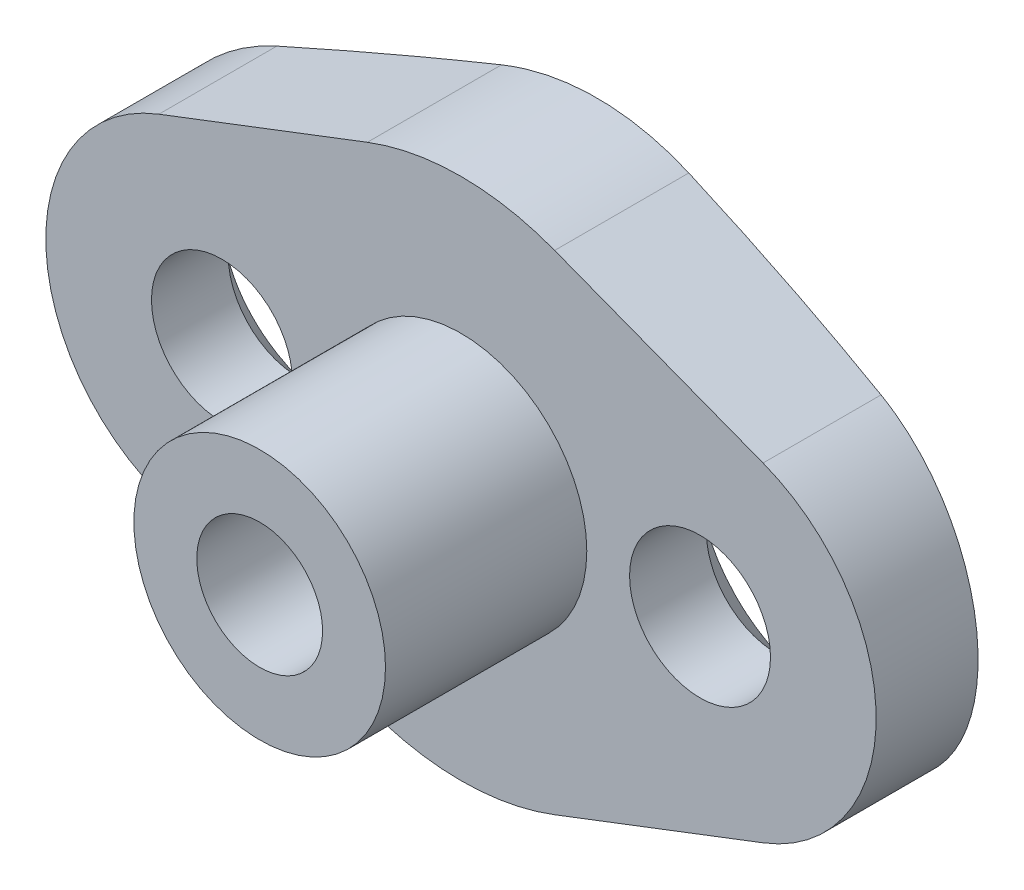
ISO-10303-21;
HEADER;
FILE_DESCRIPTION(('STEP AP214'),'2;1');
FILE_NAME('part.step','',(''),(''),'','','');
FILE_SCHEMA(('AUTOMOTIVE_DESIGN { 1 0 10303 214 1 1 1 1 }'));
ENDSEC;
DATA;
#1=APPLICATION_CONTEXT('core data for automotive mechanical design processes');
#2=APPLICATION_PROTOCOL_DEFINITION('international standard','automotive_design',2000,#1);
#3=PRODUCT_CONTEXT('',#1,'mechanical');
#4=PRODUCT('Part','Part','',(#3));
#5=PRODUCT_RELATED_PRODUCT_CATEGORY('part','',(#4));
#6=PRODUCT_DEFINITION_FORMATION('','',#4);
#7=PRODUCT_DEFINITION_CONTEXT('part definition',#1,'design');
#8=PRODUCT_DEFINITION('design','',#6,#7);
#9=PRODUCT_DEFINITION_SHAPE('','',#8);
#10=(LENGTH_UNIT() NAMED_UNIT(*) SI_UNIT(.MILLI.,.METRE.));
#11=(NAMED_UNIT(*) PLANE_ANGLE_UNIT() SI_UNIT($,.RADIAN.));
#12=(NAMED_UNIT(*) SI_UNIT($,.STERADIAN.) SOLID_ANGLE_UNIT());
#13=UNCERTAINTY_MEASURE_WITH_UNIT(LENGTH_MEASURE(1.E-05),#10,'distance_accuracy_value','');
#14=(GEOMETRIC_REPRESENTATION_CONTEXT(3) GLOBAL_UNCERTAINTY_ASSIGNED_CONTEXT((#13)) GLOBAL_UNIT_ASSIGNED_CONTEXT((#10,
#11,#12)) REPRESENTATION_CONTEXT('',''));
#15=CARTESIAN_POINT('',(0.,0.,0.));
#16=DIRECTION('',(0.,0.,1.));
#17=DIRECTION('',(1.,0.,0.));
#18=AXIS2_PLACEMENT_3D('',#15,#16,#17);
#19=CARTESIAN_POINT('',(0.,0.,3.429));
#20=DIRECTION('',(0.,0.,1.));
#21=DIRECTION('',(1.,0.,0.));
#22=AXIS2_PLACEMENT_3D('',#19,#20,#21);
#23=PLANE('',#22);
#24=CARTESIAN_POINT('',(-6.0325,0.,3.429));
#25=DIRECTION('',(0.,0.,1.));
#26=DIRECTION('',(1.,0.,0.));
#27=AXIS2_PLACEMENT_3D('',#24,#25,#26);
#28=CIRCLE('',#27,1.778);
#29=CARTESIAN_POINT('',(-4.2545,0.,3.429));
#30=VERTEX_POINT('',#29);
#31=EDGE_CURVE('E253',#30,#30,#28,.T.);
#32=ORIENTED_EDGE('',*,*,#31,.F.);
#33=EDGE_LOOP('',(#32));
#34=FACE_BOUND('',#33,.T.);
#35=CARTESIAN_POINT('',(0.,0.,3.429));
#36=DIRECTION('',(0.,0.,1.));
#37=DIRECTION('',(1.,0.,0.));
#38=AXIS2_PLACEMENT_3D('',#35,#36,#37);
#39=CIRCLE('',#38,6.604);
#40=CARTESIAN_POINT('',(2.36353684210526,6.16656384026072,3.429));
#41=VERTEX_POINT('',#40);
#42=CARTESIAN_POINT('',(-2.36353684210526,6.16656384026072,3.429));
#43=VERTEX_POINT('',#42);
#44=EDGE_CURVE('E254',#41,#43,#39,.T.);
#45=ORIENTED_EDGE('',*,*,#44,.T.);
#46=DIRECTION('',(-0.93376193825874,-0.357894736842106,0.));
#47=VECTOR('',#46,1.);
#48=CARTESIAN_POINT('',(-7.62334210526316,4.1505718155601,3.429));
#49=LINE('',#48,#47);
#50=CARTESIAN_POINT('',(-7.62334210526316,4.1505718155601,3.429));
#51=VERTEX_POINT('',#50);
#52=EDGE_CURVE('E257',#43,#51,#49,.T.);
#53=ORIENTED_EDGE('',*,*,#52,.T.);
#54=CARTESIAN_POINT('',(-6.0325,0.,3.429));
#55=DIRECTION('',(0.,0.,1.));
#56=DIRECTION('',(1.,0.,0.));
#57=AXIS2_PLACEMENT_3D('',#54,#55,#56);
#58=CIRCLE('',#57,4.445);
#59=CARTESIAN_POINT('',(-7.62334210526316,-4.1505718155601,3.429));
#60=VERTEX_POINT('',#59);
#61=EDGE_CURVE('E265',#51,#60,#58,.T.);
#62=ORIENTED_EDGE('',*,*,#61,.T.);
#63=DIRECTION('',(0.93376193825874,-0.357894736842106,0.));
#64=VECTOR('',#63,1.);
#65=CARTESIAN_POINT('',(-2.36353684210526,-6.16656384026072,3.429));
#66=LINE('',#65,#64);
#67=CARTESIAN_POINT('',(-2.36353684210527,-6.16656384026072,3.429));
#68=VERTEX_POINT('',#67);
#69=EDGE_CURVE('E267',#60,#68,#66,.T.);
#70=ORIENTED_EDGE('',*,*,#69,.T.);
#71=CARTESIAN_POINT('',(0.,0.,3.429));
#72=DIRECTION('',(0.,0.,1.));
#73=DIRECTION('',(1.,0.,0.));
#74=AXIS2_PLACEMENT_3D('',#71,#72,#73);
#75=CIRCLE('',#74,6.604);
#76=CARTESIAN_POINT('',(2.36353684210526,-6.16656384026072,3.429));
#77=VERTEX_POINT('',#76);
#78=EDGE_CURVE('E269',#68,#77,#75,.T.);
#79=ORIENTED_EDGE('',*,*,#78,.T.);
#80=DIRECTION('',(0.93376193825874,0.357894736842106,0.));
#81=VECTOR('',#80,1.);
#82=CARTESIAN_POINT('',(7.62334210526315,-4.1505718155601,3.429));
#83=LINE('',#82,#81);
#84=CARTESIAN_POINT('',(7.62334210526315,-4.1505718155601,3.429));
#85=VERTEX_POINT('',#84);
#86=EDGE_CURVE('E271',#77,#85,#83,.T.);
#87=ORIENTED_EDGE('',*,*,#86,.T.);
#88=CARTESIAN_POINT('',(6.0325,0.,3.429));
#89=DIRECTION('',(0.,0.,1.));
#90=DIRECTION('',(1.,0.,0.));
#91=AXIS2_PLACEMENT_3D('',#88,#89,#90);
#92=CIRCLE('',#91,4.445);
#93=CARTESIAN_POINT('',(7.62334210526315,4.1505718155601,3.429));
#94=VERTEX_POINT('',#93);
#95=EDGE_CURVE('E273',#85,#94,#92,.T.);
#96=ORIENTED_EDGE('',*,*,#95,.T.);
#97=DIRECTION('',(-0.93376193825874,0.357894736842106,0.));
#98=VECTOR('',#97,1.);
#99=CARTESIAN_POINT('',(2.36353684210526,6.16656384026072,3.429));
#100=LINE('',#99,#98);
#101=EDGE_CURVE('E62',#94,#41,#100,.T.);
#102=ORIENTED_EDGE('',*,*,#101,.T.);
#103=EDGE_LOOP('',(#45,#53,#62,#70,#79,#87,#96,#102));
#104=FACE_BOUND('',#103,.T.);
#105=CARTESIAN_POINT('',(6.0325,0.,3.429));
#106=DIRECTION('',(0.,0.,1.));
#107=DIRECTION('',(1.,0.,0.));
#108=AXIS2_PLACEMENT_3D('',#105,#106,#107);
#109=CIRCLE('',#108,1.778);
#110=CARTESIAN_POINT('',(7.8105,0.,3.429));
#111=VERTEX_POINT('',#110);
#112=EDGE_CURVE('E255',#111,#111,#109,.T.);
#113=ORIENTED_EDGE('',*,*,#112,.F.);
#114=EDGE_LOOP('',(#113));
#115=FACE_BOUND('',#114,.T.);
#116=CARTESIAN_POINT('',(0.,0.,3.429));
#117=DIRECTION('',(0.,0.,1.));
#118=DIRECTION('',(1.,0.,0.));
#119=AXIS2_PLACEMENT_3D('',#116,#117,#118);
#120=CIRCLE('',#119,3.175);
#121=CARTESIAN_POINT('',(3.175,0.,3.429));
#122=VERTEX_POINT('',#121);
#123=EDGE_CURVE('E343',#122,#122,#120,.T.);
#124=ORIENTED_EDGE('',*,*,#123,.F.);
#125=EDGE_LOOP('',(#124));
#126=FACE_BOUND('',#125,.T.);
#127=ADVANCED_FACE('F32',(#34,#104,#115,#126),#23,.T.);
#128=CARTESIAN_POINT('',(0.,0.,3.429));
#129=DIRECTION('',(0.,0.,-1.));
#130=DIRECTION('',(-1.,0.,0.));
#131=AXIS2_PLACEMENT_3D('',#128,#129,#130);
#132=CYLINDRICAL_SURFACE('',#131,6.604);
#133=DIRECTION('',(0.,0.,-1.));
#134=VECTOR('',#133,1.);
#135=CARTESIAN_POINT('',(2.36353684210526,6.16656384026072,3.429));
#136=LINE('',#135,#134);
#137=CARTESIAN_POINT('',(2.36353684210526,6.16656384026072,0.0433476332092745));
#138=VERTEX_POINT('',#137);
#139=EDGE_CURVE('E124',#41,#138,#136,.T.);
#140=ORIENTED_EDGE('',*,*,#139,.T.);
#141=CARTESIAN_POINT('',(2.36353684210526,6.16656384026072,0.0433476332092897));
#142=CARTESIAN_POINT('',(2.19113225550176,6.23266486368332,0.0370146986801548));
#143=CARTESIAN_POINT('',(2.01592422298994,6.29150563393318,0.031285571550085));
#144=CARTESIAN_POINT('',(1.66115963827824,6.39432576472167,0.0211661823809761));
#145=CARTESIAN_POINT('',(1.48160302088139,6.43830490229646,0.0167759404288562));
#146=CARTESIAN_POINT('',(1.1191562195515,6.51110880986811,0.00946075099816746));
#147=CARTESIAN_POINT('',(0.936261796829589,6.53991268845568,0.00653782379559852));
#148=CARTESIAN_POINT('',(0.568694591179152,6.58206773642733,0.00224688182175784));
#149=CARTESIAN_POINT('',(0.384021924124431,6.59541990589513,0.000878766418229665));
#150=CARTESIAN_POINT('',(0.0140636998647719,6.60657963426839,-0.000264129650065589));
#151=CARTESIAN_POINT('',(-0.171222214066304,6.60437548372269,-3.77100872107163E-05));
#152=CARTESIAN_POINT('',(-0.540945430951653,6.58441070930692,0.0020048369891241));
#153=CARTESIAN_POINT('',(-0.725382742391608,6.56665024133508,0.00382094857144389));
#154=CARTESIAN_POINT('',(-1.09165012542945,6.51576756721108,0.00898499810432978));
#155=CARTESIAN_POINT('',(-1.2734853359978,6.48268183051702,0.0123292991773756));
#156=CARTESIAN_POINT('',(-1.63363496052359,6.40141362126567,0.0204534834802808));
#157=CARTESIAN_POINT('',(-1.81195141073268,6.35324016932896,0.0252325088487417));
#158=CARTESIAN_POINT('',(-2.05115659197112,6.27773712085769,0.0326126985936294));
#159=CARTESIAN_POINT('',(-2.11413616686042,6.25680831823762,0.0346493351411315));
#160=CARTESIAN_POINT('',(-2.23937322268045,6.21308422357811,0.0388811498198487));
#161=CARTESIAN_POINT('',(-2.3016313178466,6.19029067653188,0.0410761795078104));
#162=CARTESIAN_POINT('',(-2.36353684210526,6.16656384026072,0.0433476332092683));
#163=B_SPLINE_CURVE_WITH_KNOTS('',3,(#141,#142,#143,#144,#145,#146,#147,#148,#149,#150,#151,
#152,#153,#154,#155,#156,#157,#158,#159,#160,#161,#162),.UNSPECIFIED.,.F.,.F.,(4,2,2,2,2,2,2,2,
2,2,4),(0.,0.554085963952449,1.10818024029252,1.6630353445262,2.21785453476585,2.77309138938259,
3.3283226797354,3.88223942425771,4.43582562403964,4.63499441789822,4.83397891964673),.UNSPECIFIED.);
#164=CARTESIAN_POINT('',(-2.36353684210526,6.16656384026072,0.0433476332092884));
#165=VERTEX_POINT('',#164);
#166=EDGE_CURVE('E54',#138,#165,#163,.T.);
#167=ORIENTED_EDGE('',*,*,#166,.T.);
#168=DIRECTION('',(0.,0.,-1.));
#169=VECTOR('',#168,1.);
#170=CARTESIAN_POINT('',(-2.36353684210526,6.16656384026072,3.429));
#171=LINE('',#170,#169);
#172=EDGE_CURVE('E46',#43,#165,#171,.T.);
#173=ORIENTED_EDGE('',*,*,#172,.F.);
#174=ORIENTED_EDGE('',*,*,#44,.F.);
#175=EDGE_LOOP('',(#140,#167,#173,#174));
#176=FACE_BOUND('',#175,.T.);
#177=ADVANCED_FACE('F34',(#176),#132,.T.);
#178=CARTESIAN_POINT('',(-7.62334210526316,4.1505718155601,3.429));
#179=DIRECTION('',(0.357894736842106,-0.933761938258741,0.));
#180=DIRECTION('',(0.93376193825874,0.357894736842106,0.));
#181=AXIS2_PLACEMENT_3D('',#178,#179,#180);
#182=PLANE('',#181);
#183=ORIENTED_EDGE('',*,*,#172,.T.);
#184=CARTESIAN_POINT('',(0.,7.0724664707527,64.4577916666666));
#185=DIRECTION('',(0.357894736842106,-0.933761938258741,0.));
#186=DIRECTION('',(0.93376193825874,0.357894736842106,0.));
#187=AXIS2_PLACEMENT_3D('',#184,#185,#186);
#188=ELLIPSE('',#187,69.0302196155758,64.4577916666666);
#189=CARTESIAN_POINT('',(-7.62334210526316,4.1505718155601,0.452389068998985));
#190=VERTEX_POINT('',#189);
#191=EDGE_CURVE('E151',#165,#190,#188,.F.);
#192=ORIENTED_EDGE('',*,*,#191,.T.);
#193=DIRECTION('',(0.,0.,-1.));
#194=VECTOR('',#193,1.);
#195=CARTESIAN_POINT('',(-7.62334210526316,4.1505718155601,3.429));
#196=LINE('',#195,#194);
#197=EDGE_CURVE('E139',#51,#190,#196,.T.);
#198=ORIENTED_EDGE('',*,*,#197,.F.);
#199=ORIENTED_EDGE('',*,*,#52,.F.);
#200=EDGE_LOOP('',(#183,#192,#198,#199));
#201=FACE_BOUND('',#200,.T.);
#202=ADVANCED_FACE('F200',(#201),#182,.F.);
#203=CARTESIAN_POINT('',(-6.0325,0.,3.429));
#204=DIRECTION('',(0.,0.,-1.));
#205=DIRECTION('',(-1.,0.,0.));
#206=AXIS2_PLACEMENT_3D('',#203,#204,#205);
#207=CYLINDRICAL_SURFACE('',#206,4.445);
#208=ORIENTED_EDGE('',*,*,#197,.T.);
#209=CARTESIAN_POINT('',(-7.62334210526316,4.1505718155601,0.452389068998985));
#210=CARTESIAN_POINT('',(-7.74057622327631,4.10565136906925,0.466349660186599));
#211=CARTESIAN_POINT('',(-7.85588548722114,4.05574633073941,0.480412686803095));
#212=CARTESIAN_POINT('',(-8.08186669999469,3.94637154507439,0.508567934648293));
#213=CARTESIAN_POINT('',(-8.19253880281101,3.88690211566458,0.522660154891219));
#214=CARTESIAN_POINT('',(-8.40842721948938,3.75882298015404,0.55069403140688));
#215=CARTESIAN_POINT('',(-8.51364547793329,3.69021656344799,0.564635739921534));
#216=CARTESIAN_POINT('',(-8.71792803546586,3.54432683131475,0.592188596513432));
#217=CARTESIAN_POINT('',(-8.81699241959098,3.46704363582785,0.605799749156832));
#218=CARTESIAN_POINT('',(-9.00830104315945,3.30430181581972,0.63250863227011));
#219=CARTESIAN_POINT('',(-9.10054273103318,3.21884015983062,0.645606169805134));
#220=CARTESIAN_POINT('',(-9.27753647828034,3.04032359412951,0.671098521303482));
#221=CARTESIAN_POINT('',(-9.36228575625208,2.94726588899328,0.683493073691196));
#222=CARTESIAN_POINT('',(-9.52358778094631,2.75429391479865,0.70738125424931));
#223=CARTESIAN_POINT('',(-9.60014580368112,2.65438412808179,0.718875461041067));
#224=CARTESIAN_POINT('',(-9.7445905992547,2.44831495237477,0.740798634319743));
#225=CARTESIAN_POINT('',(-9.81247418795911,2.34215328927112,0.751227209364205));
#226=CARTESIAN_POINT('',(-9.93869170919159,2.12494355870498,0.770796349661299));
#227=CARTESIAN_POINT('',(-9.99707449096839,2.01392446861039,0.779943467484897));
#228=CARTESIAN_POINT('',(-10.104304820242,1.78722109138748,0.796870530017214));
#229=CARTESIAN_POINT('',(-10.1531488279247,1.67153509152392,0.804649967076759));
#230=CARTESIAN_POINT('',(-10.240888341476,1.43639666961858,0.818707075194317));
#231=CARTESIAN_POINT('',(-10.279786525932,1.3169452714211,0.824985150566264));
#232=CARTESIAN_POINT('',(-10.3473618356965,1.07506548007919,0.835938634896015));
#233=CARTESIAN_POINT('',(-10.3760352297995,0.952636017560355,0.84061345877546));
#234=CARTESIAN_POINT('',(-10.4226303276747,0.707239958859992,0.848230793204893));
#235=CARTESIAN_POINT('',(-10.4406785545829,0.584298005157202,0.851193681043889));
#236=CARTESIAN_POINT('',(-10.466426749217,0.337262518172641,0.855425447746854));
#237=CARTESIAN_POINT('',(-10.4741231365493,0.213168601395575,0.856693740499732));
#238=CARTESIAN_POINT('',(-10.4790953039813,-0.035199630837515,0.857512779152884));
#239=CARTESIAN_POINT('',(-10.4763739116115,-0.159473888194154,0.857063991092791));
#240=CARTESIAN_POINT('',(-10.4605380347158,-0.407340381751441,0.854457519002144));
#241=CARTESIAN_POINT('',(-10.4474235605299,-0.5309326186305,0.852299836671751));
#242=CARTESIAN_POINT('',(-10.411022817235,-0.775743108068826,0.846331635253227));
#243=CARTESIAN_POINT('',(-10.3878035174828,-0.896971591803449,0.8425319992968));
#244=CARTESIAN_POINT('',(-10.3313943266048,-1.13698014734772,0.833346576149416));
#245=CARTESIAN_POINT('',(-10.298207886749,-1.25576105147892,0.827961338009345));
#246=CARTESIAN_POINT('',(-10.2221003651848,-1.4901199303104,0.815690385971445));
#247=CARTESIAN_POINT('',(-10.1791764612407,-1.60569696550461,0.808804237083265));
#248=CARTESIAN_POINT('',(-10.0839357099867,-1.83277025547032,0.793645793699511));
#249=CARTESIAN_POINT('',(-10.0316221925916,-1.94426794011413,0.785373990678841));
#250=CARTESIAN_POINT('',(-9.91769896320447,-2.16299151947157,0.767529519808536));
#251=CARTESIAN_POINT('',(-9.85604536916354,-2.27019405743133,0.757950733720048));
#252=CARTESIAN_POINT('',(-9.72410251093485,-2.47897980146094,0.737675625949307));
#253=CARTESIAN_POINT('',(-9.65381631239429,-2.58056498391096,0.726979701190813));
#254=CARTESIAN_POINT('',(-9.50502832630437,-2.77755672559336,0.704619154544034));
#255=CARTESIAN_POINT('',(-9.42651935727837,-2.87295776410808,0.692953687758825));
#256=CARTESIAN_POINT('',(-9.2619207242432,-3.05680964180566,0.668837724298323));
#257=CARTESIAN_POINT('',(-9.17583373855343,-3.14526291580686,0.656387505418397));
#258=CARTESIAN_POINT('',(-8.99550901236845,-3.31574944220701,0.630711820287464));
#259=CARTESIAN_POINT('',(-8.90118120285356,-3.39768625402679,0.617478482705008));
#260=CARTESIAN_POINT('',(-8.70603991854716,-3.5532766320954,0.590574177766143));
#261=CARTESIAN_POINT('',(-8.60522883559721,-3.62693322587626,0.576903372727004));
#262=CARTESIAN_POINT('',(-8.39796604231442,-3.76538247204404,0.549325981833211));
#263=CARTESIAN_POINT('',(-8.29152356411443,-3.83018904444413,0.535419805837608));
#264=CARTESIAN_POINT('',(-8.0736282003729,-3.95060749677176,0.507533798084385));
#265=CARTESIAN_POINT('',(-7.96217836060792,-4.00622487233643,0.493554015547771));
#266=CARTESIAN_POINT('',(-7.81149416165651,-4.07367917823502,0.475068459389649));
#267=CARTESIAN_POINT('',(-7.77413805550447,-4.08978946331433,0.470518575569447));
#268=CARTESIAN_POINT('',(-7.69903650036892,-4.12096240245139,0.461438870143913));
#269=CARTESIAN_POINT('',(-7.66129151305909,-4.13602616400982,0.456909032230524));
#270=CARTESIAN_POINT('',(-7.62334210526315,-4.1505718155601,0.452389068998987));
#271=B_SPLINE_CURVE_WITH_KNOTS('',3,(#209,#210,#211,#212,#213,#214,#215,#216,#217,#218,#219,
#220,#221,#222,#223,#224,#225,#226,#227,#228,#229,#230,#231,#232,#233,#234,#235,#236,#237,#238,
#239,#240,#241,#242,#243,#244,#245,#246,#247,#248,#249,#250,#251,#252,#253,#254,#255,#256,#257,
#258,#259,#260,#261,#262,#263,#264,#265,#266,#267,#268,#269,#270),.UNSPECIFIED.,.F.,.F.,(4,2,2,
2,2,2,2,2,2,2,2,2,2,2,2,2,2,2,2,2,2,2,2,2,2,2,2,2,2,2,4),(0.,0.378842897800705,
0.757673205266127,1.13636749735104,1.51505655533826,1.89388652778081,2.27285654757962,
2.65158098324695,3.03044404080111,3.40729299123099,3.78428152467548,4.16116842119043,
4.53819270994332,4.91063154373253,5.28319915995191,5.65566566330876,6.02813179610304,
6.39816614555902,6.76807251257981,7.13808622786357,7.50796898052653,7.87964676088774,
8.25119292903901,8.62306634194451,8.99480884629152,9.37129989745794,9.7476528397335,
10.1234068331714,10.4989352855171,10.6217311248764,10.7443949690389),.UNSPECIFIED.);
#272=CARTESIAN_POINT('',(-7.62334210526316,-4.1505718155601,0.452389068998983));
#273=VERTEX_POINT('',#272);
#274=EDGE_CURVE('E156',#190,#273,#271,.T.);
#275=ORIENTED_EDGE('',*,*,#274,.T.);
#276=DIRECTION('',(0.,0.,-1.));
#277=VECTOR('',#276,1.);
#278=CARTESIAN_POINT('',(-7.62334210526316,-4.1505718155601,3.429));
#279=LINE('',#278,#277);
#280=EDGE_CURVE('E136',#60,#273,#279,.T.);
#281=ORIENTED_EDGE('',*,*,#280,.F.);
#282=ORIENTED_EDGE('',*,*,#61,.F.);
#283=EDGE_LOOP('',(#208,#275,#281,#282));
#284=FACE_BOUND('',#283,.T.);
#285=ADVANCED_FACE('F195',(#284),#207,.T.);
#286=CARTESIAN_POINT('',(-2.36353684210526,-6.16656384026072,3.429));
#287=DIRECTION('',(0.357894736842106,0.933761938258741,0.));
#288=DIRECTION('',(-0.933761938258741,0.357894736842106,0.));
#289=AXIS2_PLACEMENT_3D('',#286,#287,#288);
#290=PLANE('',#289);
#291=ORIENTED_EDGE('',*,*,#280,.T.);
#292=CARTESIAN_POINT('',(0.,-7.07246647075271,64.4577916666666));
#293=DIRECTION('',(0.357894736842106,0.933761938258741,0.));
#294=DIRECTION('',(-0.933761938258741,0.357894736842106,0.));
#295=AXIS2_PLACEMENT_3D('',#292,#293,#294);
#296=ELLIPSE('',#295,69.0302196155758,64.4577916666666);
#297=CARTESIAN_POINT('',(-2.36353684210527,-6.16656384026072,0.0433476332092897));
#298=VERTEX_POINT('',#297);
#299=EDGE_CURVE('E194',#273,#298,#296,.F.);
#300=ORIENTED_EDGE('',*,*,#299,.T.);
#301=DIRECTION('',(0.,0.,-1.));
#302=VECTOR('',#301,1.);
#303=CARTESIAN_POINT('',(-2.36353684210527,-6.16656384026072,3.429));
#304=LINE('',#303,#302);
#305=EDGE_CURVE('E133',#68,#298,#304,.T.);
#306=ORIENTED_EDGE('',*,*,#305,.F.);
#307=ORIENTED_EDGE('',*,*,#69,.F.);
#308=EDGE_LOOP('',(#291,#300,#306,#307));
#309=FACE_BOUND('',#308,.T.);
#310=ADVANCED_FACE('F199',(#309),#290,.F.);
#311=CARTESIAN_POINT('',(0.,0.,3.429));
#312=DIRECTION('',(0.,0.,-1.));
#313=DIRECTION('',(-1.,0.,0.));
#314=AXIS2_PLACEMENT_3D('',#311,#312,#313);
#315=CYLINDRICAL_SURFACE('',#314,6.604);
#316=ORIENTED_EDGE('',*,*,#305,.T.);
#317=CARTESIAN_POINT('',(-2.36353684210527,-6.16656384026072,0.0433476332092897));
#318=CARTESIAN_POINT('',(-2.19113225550176,-6.23266486368332,0.037014698680153));
#319=CARTESIAN_POINT('',(-2.01592422298994,-6.29150563393318,0.0312855715500822));
#320=CARTESIAN_POINT('',(-1.66115963827824,-6.39432576472167,0.0211661823809725));
#321=CARTESIAN_POINT('',(-1.48160302088139,-6.43830490229646,0.0167759404288528));
#322=CARTESIAN_POINT('',(-1.1191562195515,-6.51110880986811,0.00946075099816516));
#323=CARTESIAN_POINT('',(-0.93626179682959,-6.53991268845568,0.00653782379559708));
#324=CARTESIAN_POINT('',(-0.568694591179153,-6.58206773642734,0.00224688182175703));
#325=CARTESIAN_POINT('',(-0.384021924124432,-6.59541990589513,0.000878766418228602));
#326=CARTESIAN_POINT('',(-0.0140636998647727,-6.60657963426839,-0.000264129650064957));
#327=CARTESIAN_POINT('',(0.171222214066304,-6.60437548372269,-3.77100872081415E-05));
#328=CARTESIAN_POINT('',(0.540945430951652,-6.58441070930692,0.00200483698912886));
#329=CARTESIAN_POINT('',(0.725382742391607,-6.56665024133508,0.00382094857144891));
#330=CARTESIAN_POINT('',(1.09165012542945,-6.51576756721108,0.00898499810432971));
#331=CARTESIAN_POINT('',(1.2734853359978,-6.48268183051702,0.0123292991773702));
#332=CARTESIAN_POINT('',(1.63363496052359,-6.40141362126567,0.0204534834802792));
#333=CARTESIAN_POINT('',(1.81195141073268,-6.35324016932896,0.0252325088487492));
#334=CARTESIAN_POINT('',(2.05115659197112,-6.27773712085769,0.0326126985936265));
#335=CARTESIAN_POINT('',(2.11413616686042,-6.25680831823762,0.0346493351411237));
#336=CARTESIAN_POINT('',(2.23937322268046,-6.21308422357811,0.0388811498198409));
#337=CARTESIAN_POINT('',(2.3016313178466,-6.19029067653188,0.0410761795078075));
#338=CARTESIAN_POINT('',(2.36353684210527,-6.16656384026072,0.0433476332092823));
#339=B_SPLINE_CURVE_WITH_KNOTS('',3,(#317,#318,#319,#320,#321,#322,#323,#324,#325,#326,#327,
#328,#329,#330,#331,#332,#333,#334,#335,#336,#337,#338),.UNSPECIFIED.,.F.,.F.,(4,2,2,2,2,2,2,2,
2,2,4),(0.,0.554085963952449,1.10818024029252,1.6630353445262,2.21785453476585,2.77309138938259,
3.3283226797354,3.88223942425771,4.43582562403964,4.63499441789822,4.83397891964673),.UNSPECIFIED.);
#340=CARTESIAN_POINT('',(2.36353684210526,-6.16656384026072,0.0433476332092745));
#341=VERTEX_POINT('',#340);
#342=EDGE_CURVE('E184',#298,#341,#339,.T.);
#343=ORIENTED_EDGE('',*,*,#342,.T.);
#344=DIRECTION('',(0.,0.,-1.));
#345=VECTOR('',#344,1.);
#346=CARTESIAN_POINT('',(2.36353684210526,-6.16656384026072,3.429));
#347=LINE('',#346,#345);
#348=EDGE_CURVE('E126',#77,#341,#347,.T.);
#349=ORIENTED_EDGE('',*,*,#348,.F.);
#350=ORIENTED_EDGE('',*,*,#78,.F.);
#351=EDGE_LOOP('',(#316,#343,#349,#350));
#352=FACE_BOUND('',#351,.T.);
#353=ADVANCED_FACE('F288',(#352),#315,.T.);
#354=CARTESIAN_POINT('',(7.62334210526315,-4.1505718155601,3.429));
#355=DIRECTION('',(-0.357894736842106,0.933761938258741,0.));
#356=DIRECTION('',(-0.93376193825874,-0.357894736842106,0.));
#357=AXIS2_PLACEMENT_3D('',#354,#355,#356);
#358=PLANE('',#357);
#359=ORIENTED_EDGE('',*,*,#348,.T.);
#360=CARTESIAN_POINT('',(0.,-7.07246647075271,64.4577916666666));
#361=DIRECTION('',(-0.357894736842106,0.933761938258741,0.));
#362=DIRECTION('',(0.93376193825874,0.357894736842106,0.));
#363=AXIS2_PLACEMENT_3D('',#360,#361,#362);
#364=ELLIPSE('',#363,69.0302196155758,64.4577916666666);
#365=CARTESIAN_POINT('',(7.62334210526316,-4.1505718155601,0.452389068998985));
#366=VERTEX_POINT('',#365);
#367=EDGE_CURVE('E114',#341,#366,#364,.F.);
#368=ORIENTED_EDGE('',*,*,#367,.T.);
#369=DIRECTION('',(0.,0.,-1.));
#370=VECTOR('',#369,1.);
#371=CARTESIAN_POINT('',(7.62334210526315,-4.1505718155601,3.429));
#372=LINE('',#371,#370);
#373=EDGE_CURVE('E112',#85,#366,#372,.T.);
#374=ORIENTED_EDGE('',*,*,#373,.F.);
#375=ORIENTED_EDGE('',*,*,#86,.F.);
#376=EDGE_LOOP('',(#359,#368,#374,#375));
#377=FACE_BOUND('',#376,.T.);
#378=ADVANCED_FACE('F279',(#377),#358,.F.);
#379=CARTESIAN_POINT('',(6.0325,0.,3.429));
#380=DIRECTION('',(0.,0.,-1.));
#381=DIRECTION('',(-1.,0.,0.));
#382=AXIS2_PLACEMENT_3D('',#379,#380,#381);
#383=CYLINDRICAL_SURFACE('',#382,4.445);
#384=ORIENTED_EDGE('',*,*,#373,.T.);
#385=CARTESIAN_POINT('',(7.62334210526316,-4.1505718155601,0.452389068998985));
#386=CARTESIAN_POINT('',(7.74057622327631,-4.10565136906925,0.466349660186579));
#387=CARTESIAN_POINT('',(7.85588548722114,-4.05574633073941,0.480412686803077));
#388=CARTESIAN_POINT('',(8.08186669999469,-3.94637154507439,0.508567934648285));
#389=CARTESIAN_POINT('',(8.192538802811,-3.88690211566458,0.52266015489122));
#390=CARTESIAN_POINT('',(8.40842721948938,-3.75882298015404,0.550694031406879));
#391=CARTESIAN_POINT('',(8.51364547793328,-3.69021656344799,0.564635739921522));
#392=CARTESIAN_POINT('',(8.71792803546586,-3.54432683131475,0.592188596513418));
#393=CARTESIAN_POINT('',(8.81699241959097,-3.46704363582785,0.605799749156827));
#394=CARTESIAN_POINT('',(9.00830104315945,-3.30430181581972,0.632508632270116));
#395=CARTESIAN_POINT('',(9.10054273103318,-3.21884015983062,0.645606169805141));
#396=CARTESIAN_POINT('',(9.27753647828034,-3.04032359412951,0.671098521303487));
#397=CARTESIAN_POINT('',(9.36228575625208,-2.94726588899328,0.683493073691199));
#398=CARTESIAN_POINT('',(9.5235877809463,-2.75429391479865,0.707381254249309));
#399=CARTESIAN_POINT('',(9.60014580368112,-2.65438412808179,0.718875461041066));
#400=CARTESIAN_POINT('',(9.7445905992547,-2.44831495237478,0.740798634319744));
#401=CARTESIAN_POINT('',(9.81247418795911,-2.34215328927113,0.75122720936421));
#402=CARTESIAN_POINT('',(9.93869170919159,-2.12494355870499,0.770796349661297));
#403=CARTESIAN_POINT('',(9.99707449096838,-2.01392446861039,0.779943467484884));
#404=CARTESIAN_POINT('',(10.104304820242,-1.78722109138748,0.796870530017202));
#405=CARTESIAN_POINT('',(10.1531488279247,-1.67153509152392,0.804649967076759));
#406=CARTESIAN_POINT('',(10.240888341476,-1.43639666961858,0.81870707519432));
#407=CARTESIAN_POINT('',(10.279786525932,-1.31694527142111,0.824985150566258));
#408=CARTESIAN_POINT('',(10.3473618356965,-1.07506548007919,0.835938634896006));
#409=CARTESIAN_POINT('',(10.3760352297995,-0.952636017560359,0.840613458775458));
#410=CARTESIAN_POINT('',(10.4226303276747,-0.707239958859996,0.848230793204899));
#411=CARTESIAN_POINT('',(10.4406785545829,-0.584298005157205,0.851193681043896));
#412=CARTESIAN_POINT('',(10.466426749217,-0.337262518172645,0.855425447746861));
#413=CARTESIAN_POINT('',(10.4741231365493,-0.213168601395578,0.856693740499737));
#414=CARTESIAN_POINT('',(10.4790953039813,0.0351996308375116,0.857512779152887));
#415=CARTESIAN_POINT('',(10.4763739116115,0.15947388819415,0.857063991092793));
#416=CARTESIAN_POINT('',(10.4605380347158,0.407340381751437,0.854457519002146));
#417=CARTESIAN_POINT('',(10.4474235605299,0.530932618630496,0.852299836671754));
#418=CARTESIAN_POINT('',(10.411022817235,0.775743108068822,0.846331635253231));
#419=CARTESIAN_POINT('',(10.3878035174828,0.896971591803444,0.842531999296804));
#420=CARTESIAN_POINT('',(10.3313943266048,1.13698014734771,0.833346576149423));
#421=CARTESIAN_POINT('',(10.298207886749,1.25576105147891,0.827961338009354));
#422=CARTESIAN_POINT('',(10.2221003651848,1.4901199303104,0.815690385971458));
#423=CARTESIAN_POINT('',(10.1791764612407,1.60569696550461,0.808804237083279));
#424=CARTESIAN_POINT('',(10.0839357099867,1.83277025547032,0.793645793699514));
#425=CARTESIAN_POINT('',(10.0316221925916,1.94426794011412,0.78537399067883));
#426=CARTESIAN_POINT('',(9.91769896320447,2.16299151947157,0.767529519808527));
#427=CARTESIAN_POINT('',(9.85604536916354,2.27019405743132,0.757950733720053));
#428=CARTESIAN_POINT('',(9.72410251093485,2.47897980146094,0.737675625949319));
#429=CARTESIAN_POINT('',(9.6538163123943,2.58056498391096,0.726979701190818));
#430=CARTESIAN_POINT('',(9.50502832630437,2.77755672559336,0.704619154544032));
#431=CARTESIAN_POINT('',(9.42651935727838,2.87295776410807,0.692953687758824));
#432=CARTESIAN_POINT('',(9.2619207242432,3.05680964180565,0.668837724298319));
#433=CARTESIAN_POINT('',(9.17583373855343,3.14526291580686,0.656387505418389));
#434=CARTESIAN_POINT('',(8.99550901236845,3.315749442207,0.630711820287454));
#435=CARTESIAN_POINT('',(8.90118120285356,3.39768625402678,0.617478482704999));
#436=CARTESIAN_POINT('',(8.70603991854716,3.55327663209539,0.590574177766138));
#437=CARTESIAN_POINT('',(8.60522883559721,3.62693322587625,0.576903372727002));
#438=CARTESIAN_POINT('',(8.39796604231442,3.76538247204403,0.549325981833211));
#439=CARTESIAN_POINT('',(8.29152356411443,3.83018904444413,0.535419805837609));
#440=CARTESIAN_POINT('',(8.07362820037291,3.95060749677175,0.507533798084395));
#441=CARTESIAN_POINT('',(7.96217836060792,4.00622487233643,0.49355401554779));
#442=CARTESIAN_POINT('',(7.81149416165651,4.07367917823502,0.475068459389649));
#443=CARTESIAN_POINT('',(7.77413805550448,4.08978946331432,0.470518575569441));
#444=CARTESIAN_POINT('',(7.69903650036892,4.12096240245139,0.461438870143902));
#445=CARTESIAN_POINT('',(7.6612915130591,4.13602616400982,0.456909032230515));
#446=CARTESIAN_POINT('',(7.62334210526315,4.1505718155601,0.452389068998992));
#447=B_SPLINE_CURVE_WITH_KNOTS('',3,(#385,#386,#387,#388,#389,#390,#391,#392,#393,#394,#395,
#396,#397,#398,#399,#400,#401,#402,#403,#404,#405,#406,#407,#408,#409,#410,#411,#412,#413,#414,
#415,#416,#417,#418,#419,#420,#421,#422,#423,#424,#425,#426,#427,#428,#429,#430,#431,#432,#433,
#434,#435,#436,#437,#438,#439,#440,#441,#442,#443,#444,#445,#446),.UNSPECIFIED.,.F.,.F.,(4,2,2,
2,2,2,2,2,2,2,2,2,2,2,2,2,2,2,2,2,2,2,2,2,2,2,2,2,2,2,4),(0.,0.378842897800706,
0.757673205266127,1.13636749735104,1.51505655533826,1.89388652778081,2.27285654757962,
2.65158098324695,3.03044404080111,3.40729299123099,3.78428152467548,4.16116842119043,
4.53819270994332,4.91063154373252,5.28319915995191,5.65566566330875,6.02813179610304,
6.39816614555902,6.76807251257981,7.13808622786357,7.50796898052653,7.87964676088774,
8.251192929039,8.62306634194451,8.99480884629152,9.37129989745794,9.74765283973349,
10.1234068331714,10.4989352855171,10.6217311248764,10.7443949690389),.UNSPECIFIED.);
#448=CARTESIAN_POINT('',(7.62334210526315,4.1505718155601,0.452389068998997));
#449=VERTEX_POINT('',#448);
#450=EDGE_CURVE('E106',#366,#449,#447,.T.);
#451=ORIENTED_EDGE('',*,*,#450,.T.);
#452=DIRECTION('',(0.,0.,-1.));
#453=VECTOR('',#452,1.);
#454=CARTESIAN_POINT('',(7.62334210526315,4.1505718155601,3.429));
#455=LINE('',#454,#453);
#456=EDGE_CURVE('E110',#94,#449,#455,.T.);
#457=ORIENTED_EDGE('',*,*,#456,.F.);
#458=ORIENTED_EDGE('',*,*,#95,.F.);
#459=EDGE_LOOP('',(#384,#451,#457,#458));
#460=FACE_BOUND('',#459,.T.);
#461=ADVANCED_FACE('F107',(#460),#383,.T.);
#462=CARTESIAN_POINT('',(2.36353684210526,6.16656384026072,3.429));
#463=DIRECTION('',(-0.357894736842106,-0.933761938258741,0.));
#464=DIRECTION('',(0.933761938258741,-0.357894736842106,0.));
#465=AXIS2_PLACEMENT_3D('',#462,#463,#464);
#466=PLANE('',#465);
#467=ORIENTED_EDGE('',*,*,#456,.T.);
#468=CARTESIAN_POINT('',(0.,7.0724664707527,64.4577916666666));
#469=DIRECTION('',(-0.357894736842106,-0.933761938258741,0.));
#470=DIRECTION('',(-0.933761938258741,0.357894736842106,0.));
#471=AXIS2_PLACEMENT_3D('',#468,#469,#470);
#472=ELLIPSE('',#471,69.0302196155758,64.4577916666666);
#473=EDGE_CURVE('E115',#449,#138,#472,.F.);
#474=ORIENTED_EDGE('',*,*,#473,.T.);
#475=ORIENTED_EDGE('',*,*,#139,.F.);
#476=ORIENTED_EDGE('',*,*,#101,.F.);
#477=EDGE_LOOP('',(#467,#474,#475,#476));
#478=FACE_BOUND('',#477,.T.);
#479=ADVANCED_FACE('F123',(#478),#466,.F.);
#480=CARTESIAN_POINT('',(-6.0325,0.,3.429));
#481=DIRECTION('',(0.,0.,-1.));
#482=DIRECTION('',(-1.,0.,0.));
#483=AXIS2_PLACEMENT_3D('',#480,#481,#482);
#484=CYLINDRICAL_SURFACE('',#483,1.778);
#485=CARTESIAN_POINT('',(-6.0325,0.,1.4919191442332));
#486=DIRECTION('',(0.,0.,-1.));
#487=DIRECTION('',(-1.,0.,0.));
#488=AXIS2_PLACEMENT_3D('',#485,#486,#487);
#489=CIRCLE('',#488,1.778);
#490=CARTESIAN_POINT('',(-7.8105,0.,1.4919191442332));
#491=VERTEX_POINT('',#490);
#492=EDGE_CURVE('E147',#491,#491,#489,.F.);
#493=ORIENTED_EDGE('',*,*,#492,.F.);
#494=EDGE_LOOP('',(#493));
#495=FACE_BOUND('',#494,.T.);
#496=ORIENTED_EDGE('',*,*,#31,.T.);
#497=EDGE_LOOP('',(#496));
#498=FACE_BOUND('',#497,.T.);
#499=ADVANCED_FACE('F244',(#495,#498),#484,.F.);
#500=CARTESIAN_POINT('',(6.0325,0.,3.429));
#501=DIRECTION('',(0.,0.,-1.));
#502=DIRECTION('',(-1.,0.,0.));
#503=AXIS2_PLACEMENT_3D('',#500,#501,#502);
#504=CYLINDRICAL_SURFACE('',#503,1.778);
#505=CARTESIAN_POINT('',(6.0325,0.,1.4919191442332));
#506=DIRECTION('',(0.,0.,-1.));
#507=DIRECTION('',(-1.,0.,0.));
#508=AXIS2_PLACEMENT_3D('',#505,#506,#507);
#509=CIRCLE('',#508,1.778);
#510=CARTESIAN_POINT('',(4.2545,0.,1.4919191442332));
#511=VERTEX_POINT('',#510);
#512=EDGE_CURVE('E144',#511,#511,#509,.F.);
#513=ORIENTED_EDGE('',*,*,#512,.F.);
#514=EDGE_LOOP('',(#513));
#515=FACE_BOUND('',#514,.T.);
#516=ORIENTED_EDGE('',*,*,#112,.T.);
#517=EDGE_LOOP('',(#516));
#518=FACE_BOUND('',#517,.T.);
#519=ADVANCED_FACE('F240',(#515,#518),#504,.F.);
#520=CARTESIAN_POINT('',(0.,0.,8.509));
#521=DIRECTION('',(0.,0.,1.));
#522=DIRECTION('',(1.,0.,0.));
#523=AXIS2_PLACEMENT_3D('',#520,#521,#522);
#524=PLANE('',#523);
#525=CARTESIAN_POINT('',(0.,0.,8.509));
#526=DIRECTION('',(0.,0.,1.));
#527=DIRECTION('',(1.,0.,0.));
#528=AXIS2_PLACEMENT_3D('',#525,#526,#527);
#529=CIRCLE('',#528,3.175);
#530=CARTESIAN_POINT('',(3.175,0.,8.509));
#531=VERTEX_POINT('',#530);
#532=EDGE_CURVE('E260',#531,#531,#529,.T.);
#533=ORIENTED_EDGE('',*,*,#532,.T.);
#534=EDGE_LOOP('',(#533));
#535=FACE_BOUND('',#534,.T.);
#536=CARTESIAN_POINT('',(0.,0.,8.509));
#537=DIRECTION('',(0.,0.,1.));
#538=DIRECTION('',(1.,0.,0.));
#539=AXIS2_PLACEMENT_3D('',#536,#537,#538);
#540=CIRCLE('',#539,1.5875);
#541=CARTESIAN_POINT('',(1.5875,0.,8.509));
#542=VERTEX_POINT('',#541);
#543=EDGE_CURVE('E146',#542,#542,#540,.T.);
#544=ORIENTED_EDGE('',*,*,#543,.F.);
#545=EDGE_LOOP('',(#544));
#546=FACE_BOUND('',#545,.T.);
#547=ADVANCED_FACE('F233',(#535,#546),#524,.T.);
#548=CARTESIAN_POINT('',(0.,0.,8.509));
#549=DIRECTION('',(0.,0.,-1.));
#550=DIRECTION('',(-1.,0.,0.));
#551=AXIS2_PLACEMENT_3D('',#548,#549,#550);
#552=CYLINDRICAL_SURFACE('',#551,3.175);
#553=ORIENTED_EDGE('',*,*,#532,.F.);
#554=EDGE_LOOP('',(#553));
#555=FACE_BOUND('',#554,.T.);
#556=ORIENTED_EDGE('',*,*,#123,.T.);
#557=EDGE_LOOP('',(#556));
#558=FACE_BOUND('',#557,.T.);
#559=ADVANCED_FACE('F225',(#555,#558),#552,.T.);
#560=CARTESIAN_POINT('',(0.,0.,8.509));
#561=DIRECTION('',(0.,0.,-1.));
#562=DIRECTION('',(-1.,0.,0.));
#563=AXIS2_PLACEMENT_3D('',#560,#561,#562);
#564=CYLINDRICAL_SURFACE('',#563,1.5875);
#565=ORIENTED_EDGE('',*,*,#543,.T.);
#566=EDGE_LOOP('',(#565));
#567=FACE_BOUND('',#566,.T.);
#568=CARTESIAN_POINT('',(0.,0.,3.429));
#569=DIRECTION('',(0.,0.,1.));
#570=DIRECTION('',(1.,0.,0.));
#571=AXIS2_PLACEMENT_3D('',#568,#569,#570);
#572=CIRCLE('',#571,1.5875);
#573=CARTESIAN_POINT('',(1.5875,0.,3.429));
#574=VERTEX_POINT('',#573);
#575=EDGE_CURVE('E11',#574,#574,#572,.F.);
#576=ORIENTED_EDGE('',*,*,#575,.T.);
#577=EDGE_LOOP('',(#576));
#578=FACE_BOUND('',#577,.T.);
#579=ADVANCED_FACE('F218',(#567,#578),#564,.F.);
#580=ORIENTED_EDGE('',*,*,#575,.F.);
#581=EDGE_LOOP('',(#580));
#582=FACE_BOUND('',#581,.T.);
#583=ADVANCED_FACE('F210',(#582),#23,.T.);
#584=CARTESIAN_POINT('',(6.0325,0.,0.));
#585=DIRECTION('',(0.,0.,-1.));
#586=DIRECTION('',(-1.,0.,0.));
#587=AXIS2_PLACEMENT_3D('',#584,#585,#586);
#588=CONICAL_SURFACE('',#587,3.556,0.872664625997167);
#589=CARTESIAN_POINT('',(3.60086709345475,-2.42766061461716,0.10065792812156));
#590=CARTESIAN_POINT('',(3.47905830942974,-2.31714221495511,0.0938425265217376));
#591=CARTESIAN_POINT('',(3.36578215059956,-2.19707012342934,0.0878521965224553));
#592=CARTESIAN_POINT('',(3.15883380087953,-1.94089950557312,0.0773640965425422));
#593=CARTESIAN_POINT('',(3.06518164224728,-1.80478482216327,0.072867849011662));
#594=CARTESIAN_POINT('',(2.89164016328489,-1.50636273436443,0.0648293088340968));
#595=CARTESIAN_POINT('',(2.81390214497895,-1.34279547121634,0.0614181415527235));
#596=CARTESIAN_POINT('',(2.68623062355851,-1.00513934756768,0.0559658032754717));
#597=CARTESIAN_POINT('',(2.63630136583208,-0.831048885051221,0.0539248414504547));
#598=CARTESIAN_POINT('',(2.56451191939889,-0.472822404355903,0.0510255106969483));
#599=CARTESIAN_POINT('',(2.54335077126081,-0.288545758326616,0.0501965576740766));
#600=CARTESIAN_POINT('',(2.53183371244634,0.0809741040143548,0.0497428163174182));
#601=CARTESIAN_POINT('',(2.54148024688772,0.266217395881025,0.0501181235623409));
#602=CARTESIAN_POINT('',(2.59166728631962,0.634759583123568,0.0521179875800475));
#603=CARTESIAN_POINT('',(2.63257927200564,0.818008023356927,0.0537575679491777));
#604=CARTESIAN_POINT('',(2.74477746538949,1.17495439591089,0.0584420337291638));
#605=CARTESIAN_POINT('',(2.81606349918827,1.34865238290382,0.0614869110943493));
#606=CARTESIAN_POINT('',(2.98660789442357,1.6800700994956,0.0691724918218904));
#607=CARTESIAN_POINT('',(3.08565418273092,1.83789909855139,0.0738011529549371));
#608=CARTESIAN_POINT('',(3.30936571623531,2.13415355768267,0.0849130559906078));
#609=CARTESIAN_POINT('',(3.43402761712637,2.27258154673782,0.0913960558389904));
#610=CARTESIAN_POINT('',(3.70234246128031,2.52260090828659,0.10627919847957));
#611=CARTESIAN_POINT('',(3.84548542156224,2.63474226986461,0.114631168930348));
#612=CARTESIAN_POINT('',(4.14886749615946,2.8326082751905,0.133481731339205));
#613=CARTESIAN_POINT('',(4.30910377975807,2.91833728380588,0.143979968130836));
#614=CARTESIAN_POINT('',(4.63760642179974,3.05871122652332,0.166844423773977));
#615=CARTESIAN_POINT('',(4.80555782801433,3.11410289000627,0.179155295612448));
#616=CARTESIAN_POINT('',(5.14829597406248,3.19542285687013,0.205698557685336));
#617=CARTESIAN_POINT('',(5.32308207469873,3.2213539086947,0.219930768535289));
#618=CARTESIAN_POINT('',(5.67203413559787,3.24289501063319,0.249807746910361));
#619=CARTESIAN_POINT('',(5.84617760949467,3.23890238957226,0.265431291681873));
#620=CARTESIAN_POINT('',(6.19122440378345,3.20181626564792,0.297791023455695));
#621=CARTESIAN_POINT('',(6.36212767481093,3.16872231978907,0.314527227391894));
#622=CARTESIAN_POINT('',(6.69692703229457,3.07433174864562,0.348614735646407));
#623=CARTESIAN_POINT('',(6.86077851411651,3.0128782109769,0.36596895991314));
#624=CARTESIAN_POINT('',(7.17605436685707,2.8636821826281,0.400502207717836));
#625=CARTESIAN_POINT('',(7.32747765220876,2.7759373985904,0.41768121583665));
#626=CARTESIAN_POINT('',(7.61652574780255,2.57497536819752,0.451409013419692));
#627=CARTESIAN_POINT('',(7.75385496926227,2.46133018781775,0.467941012555084));
#628=CARTESIAN_POINT('',(8.00795593846883,2.21280116343679,0.499242787587482));
#629=CARTESIAN_POINT('',(8.12472578697099,2.07791535943611,0.514012400637276));
#630=CARTESIAN_POINT('',(8.33651933900732,1.78815840490081,0.541275924114869));
#631=CARTESIAN_POINT('',(8.43112797325253,1.63297955807781,0.553725621570156));
#632=CARTESIAN_POINT('',(8.59340335252216,1.30891185632361,0.575344497941393));
#633=CARTESIAN_POINT('',(8.66106883335538,1.14002235852677,0.584513522923898));
#634=CARTESIAN_POINT('',(8.76810875250304,0.791709978247318,0.599118461063348));
#635=CARTESIAN_POINT('',(8.80722848667777,0.612207351849846,0.604520746348434));
#636=CARTESIAN_POINT('',(8.85511505810774,0.249122623921978,0.61114384491152));
#637=CARTESIAN_POINT('',(8.86388151682491,0.0655404715442284,0.612364606041403));
#638=CARTESIAN_POINT('',(8.85080694501473,-0.300838094613951,0.610550813796046));
#639=CARTESIAN_POINT('',(8.82891147330537,-0.483632531307924,0.607508691536585));
#640=CARTESIAN_POINT('',(8.75502245006798,-0.842917991175514,0.59733549273144));
#641=CARTESIAN_POINT('',(8.70302851759652,-1.01940893453848,0.590204364432955));
#642=CARTESIAN_POINT('',(8.57037753451919,-1.36106587570076,0.572269145562639));
#643=CARTESIAN_POINT('',(8.48972125013175,-1.52623217609613,0.56146515317625));
#644=CARTESIAN_POINT('',(8.30194792302421,-1.84052451182986,0.536797473678084));
#645=CARTESIAN_POINT('',(8.19483060289378,-1.98965037898113,0.52293375448912));
#646=CARTESIAN_POINT('',(7.95734728476476,-2.26718029249227,0.492943652932342));
#647=CARTESIAN_POINT('',(7.82703881252856,-2.39563414787911,0.476822889809722));
#648=CARTESIAN_POINT('',(7.54655894288273,-2.62841473271911,0.443135056376785));
#649=CARTESIAN_POINT('',(7.3963883900781,-2.73274248758009,0.425568047577869));
#650=CARTESIAN_POINT('',(7.08203771110241,-2.91304194807381,0.390043360457435));
#651=CARTESIAN_POINT('',(6.91802080284893,-2.98929922075952,0.372091701511431));
#652=CARTESIAN_POINT('',(6.57928965342002,-3.1124613329561,0.336431620910991));
#653=CARTESIAN_POINT('',(6.40457694085633,-3.15937035612781,0.318723164939576));
#654=CARTESIAN_POINT('',(6.05290258499239,-3.22157171350983,0.284589354695387));
#655=CARTESIAN_POINT('',(5.87604468040895,-3.23744087392234,0.268146157434924));
#656=CARTESIAN_POINT('',(5.52206470387054,-3.23862897397584,0.23672606255029));
#657=CARTESIAN_POINT('',(5.34494261505892,-3.22394587286121,0.221749262944946));
#658=CARTESIAN_POINT('',(4.99852804973583,-3.1648586236876,0.193872017857277));
#659=CARTESIAN_POINT('',(4.82915555149676,-3.12093504923147,0.180942117192983));
#660=CARTESIAN_POINT('',(4.50020741425851,-3.00517426331914,0.157074693477776));
#661=CARTESIAN_POINT('',(4.34062297170052,-2.93336257424643,0.146135362120494));
#662=CARTESIAN_POINT('',(4.08263773691264,-2.79020604928089,0.129335825009802));
#663=CARTESIAN_POINT('',(3.98051538533037,-2.72551109943564,0.122948291030347));
#664=CARTESIAN_POINT('',(3.78435194639406,-2.5848131532183,0.111111654106036));
#665=CARTESIAN_POINT('',(3.69030924405229,-2.50881242501814,0.105662363402261));
#666=CARTESIAN_POINT('',(3.60086709345475,-2.42766061461716,0.10065792812156));
#667=B_SPLINE_CURVE_WITH_KNOTS('',3,(#589,#590,#591,#592,#593,#594,#595,#596,#597,#598,#599,
#600,#601,#602,#603,#604,#605,#606,#607,#608,#609,#610,#611,#612,#613,#614,#615,#616,#617,#618,
#619,#620,#621,#622,#623,#624,#625,#626,#627,#628,#629,#630,#631,#632,#633,#634,#635,#636,#637,
#638,#639,#640,#641,#642,#643,#644,#645,#646,#647,#648,#649,#650,#651,#652,#653,#654,#655,#656,
#657,#658,#659,#660,#661,#662,#663,#664,#665,#666),.UNSPECIFIED.,.T.,.F.,(4,2,2,2,2,2,2,2,2,2,2,
2,2,2,2,2,2,2,2,2,2,2,2,2,2,2,2,2,2,2,2,2,2,2,2,2,2,2,4),(0.,0.493471471970303,0.98744425363686,
1.52832287085661,2.06928403798582,2.62316831053187,3.17709654438328,3.73771061659786,
4.29832147919903,4.85476114455197,5.4111282087339,5.95453609330992,6.49785412685018,
7.02711735666523,7.55633120632238,8.07853068528337,8.60073811357296,9.12587018875872,
9.65104808400168,10.185628809718,10.7202588933356,11.2642191487276,11.8082049241006,
12.35698705412,12.9057760280198,13.455540629654,14.0053121895773,14.5550690537976,
15.1048316817647,15.6532491596875,16.2016433244781,16.7442933775333,17.2868660569322,
17.8192563262505,18.3516821580199,18.8755666394161,19.3989728026861,19.7613932532789,
20.1237410926802),.UNSPECIFIED.);
#668=CARTESIAN_POINT('',(3.60086709345475,-2.42766061461716,0.10065792812156));
#669=VERTEX_POINT('',#668);
#670=EDGE_CURVE('E121',#669,#669,#667,.T.);
#671=ORIENTED_EDGE('',*,*,#670,.T.);
#672=EDGE_LOOP('',(#671));
#673=FACE_BOUND('',#672,.T.);
#674=ORIENTED_EDGE('',*,*,#512,.T.);
#675=EDGE_LOOP('',(#674));
#676=FACE_BOUND('',#675,.T.);
#677=ADVANCED_FACE('F217',(#673,#676),#588,.F.);
#678=CARTESIAN_POINT('',(-6.0325,0.,0.));
#679=DIRECTION('',(0.,0.,-1.));
#680=DIRECTION('',(-1.,0.,0.));
#681=AXIS2_PLACEMENT_3D('',#678,#679,#680);
#682=CONICAL_SURFACE('',#681,3.556,0.872664625997167);
#683=CARTESIAN_POINT('',(-8.0558888466822,-2.15179756036691,0.505390918634337));
#684=CARTESIAN_POINT('',(-8.17550851721219,-2.01465448198263,0.520458932763884));
#685=CARTESIAN_POINT('',(-8.2836534105184,-1.86719695052385,0.534422420419842));
#686=CARTESIAN_POINT('',(-8.47393347095852,-1.55595608649306,0.559367354644237));
#687=CARTESIAN_POINT('',(-8.55603467314808,-1.39215179805638,0.570344904458471));
#688=CARTESIAN_POINT('',(-8.69187508786014,-1.05297314889574,0.588683861020631));
#689=CARTESIAN_POINT('',(-8.74561472185576,-0.877598960152313,0.59604532150611));
#690=CARTESIAN_POINT('',(-8.82323305664385,-0.520300632392439,0.606722625493095));
#691=CARTESIAN_POINT('',(-8.84712003801827,-0.338378324115793,0.610039590857644));
#692=CARTESIAN_POINT('',(-8.86443380631961,0.0275161527535048,0.612441005395957));
#693=CARTESIAN_POINT('',(-8.85776431973526,0.211492975845628,0.611512077158958));
#694=CARTESIAN_POINT('',(-8.81392728550692,0.57571628338235,0.605445805225055));
#695=CARTESIAN_POINT('',(-8.77675788050188,0.755962539960361,0.60030820523166));
#696=CARTESIAN_POINT('',(-8.67294084381715,1.10762124643568,0.58612559441714));
#697=CARTESIAN_POINT('',(-8.60628931223379,1.27903252428919,0.577080066657961));
#698=CARTESIAN_POINT('',(-8.44533480416623,1.60811565077603,0.555602449721591));
#699=CARTESIAN_POINT('',(-8.35103155501051,1.76578736390464,0.543170327149525));
#700=CARTESIAN_POINT('',(-8.13749218453347,2.06264528448974,0.51563293102478));
#701=CARTESIAN_POINT('',(-8.01829029465113,2.20185644691009,0.500531331889995));
#702=CARTESIAN_POINT('',(-7.75812290873962,2.45794702321815,0.46845215357064));
#703=CARTESIAN_POINT('',(-7.61715801029836,2.5748270500968,0.451474625900611));
#704=CARTESIAN_POINT('',(-7.31857654037413,2.78183023986209,0.416650858099246));
#705=CARTESIAN_POINT('',(-7.16110363422193,2.87216185812446,0.398812740537667));
#706=CARTESIAN_POINT('',(-6.83298955687014,3.02442840854567,0.362984140930322));
#707=CARTESIAN_POINT('',(-6.66234969432178,3.0863661585077,0.344993674184215));
#708=CARTESIAN_POINT('',(-6.31586730424059,3.17890684166197,0.309942852075929));
#709=CARTESIAN_POINT('',(-6.14016549722605,3.21003239261594,0.292871800048476));
#710=CARTESIAN_POINT('',(-5.7859159835039,3.24163393383716,0.259959121634972));
#711=CARTESIAN_POINT('',(-5.60736863516524,3.24211375360602,0.244117341885716));
#712=CARTESIAN_POINT('',(-5.25597873321436,3.2125335838939,0.214409665137234));
#713=CARTESIAN_POINT('',(-5.08309157500201,3.18303229097363,0.200512915709811));
#714=CARTESIAN_POINT('',(-4.74467216364627,3.09517033755411,0.174638311324276));
#715=CARTESIAN_POINT('',(-4.57913950583198,3.03681126706159,0.162660350692814));
#716=CARTESIAN_POINT('',(-4.26108801794789,2.89345501971122,0.140800676984448));
#717=CARTESIAN_POINT('',(-4.10849836265458,2.80861655958182,0.130907047312957));
#718=CARTESIAN_POINT('',(-3.81940244775213,2.61478859635876,0.113094283876652));
#719=CARTESIAN_POINT('',(-3.68289695257131,2.50579794609788,0.10517524393778));
#720=CARTESIAN_POINT('',(-3.42790108059791,2.26539003441252,0.0910848273973682));
#721=CARTESIAN_POINT('',(-3.30966186880083,2.13370520840221,0.0849369556779323));
#722=CARTESIAN_POINT('',(-3.09626516617881,1.85274982183078,0.0743194456273335));
#723=CARTESIAN_POINT('',(-3.00111047290218,1.70347713309905,0.069850010665305));
#724=CARTESIAN_POINT('',(-2.83405034354283,1.38759133152726,0.0622773577044808));
#725=CARTESIAN_POINT('',(-2.76278849046834,1.22063698983899,0.059211251980838));
#726=CARTESIAN_POINT('',(-2.6485309412522,0.877302771391042,0.0544107290094173));
#727=CARTESIAN_POINT('',(-2.60553909218705,0.700921615328884,0.0526764930015263));
#728=CARTESIAN_POINT('',(-2.54810802767752,0.339230490791831,0.0503781450025086));
#729=CARTESIAN_POINT('',(-2.53437545146259,0.153807879703921,0.0498429762388809));
#730=CARTESIAN_POINT('',(-2.53787314971903,-0.216754099498378,0.0499807609650208));
#731=CARTESIAN_POINT('',(-2.55510603119627,-0.40189344245079,0.0506538161760958));
#732=CARTESIAN_POINT('',(-2.62046945861499,-0.768527199314576,0.0532800265645735));
#733=CARTESIAN_POINT('',(-2.66890277411006,-0.949967724238495,0.0552457295515728));
#734=CARTESIAN_POINT('',(-2.79580075380171,-1.30201597999444,0.0606301446434153));
#735=CARTESIAN_POINT('',(-2.87426459243996,-1.47262400846844,0.0640488168054899));
#736=CARTESIAN_POINT('',(-3.0583464730043,-1.79626180336731,0.0725309731157037));
#737=CARTESIAN_POINT('',(-3.16369109970775,-1.94944733663503,0.0775780235970139));
#738=CARTESIAN_POINT('',(-3.39913119934887,-2.23536902313354,0.089580116664406));
#739=CARTESIAN_POINT('',(-3.5292232626046,-2.36810798892179,0.0965348964633466));
#740=CARTESIAN_POINT('',(-3.80705750258827,-2.60585959123846,0.112379516619594));
#741=CARTESIAN_POINT('',(-3.9542901153933,-2.71147100527019,0.121217863541547));
#742=CARTESIAN_POINT('',(-4.26464588857051,-2.89569099528112,0.141045585797864));
#743=CARTESIAN_POINT('',(-4.42776651019121,-2.97430387631054,0.152034617755706));
#744=CARTESIAN_POINT('',(-4.76081558502092,-3.10035018269977,0.175844777859796));
#745=CARTESIAN_POINT('',(-4.93047130741502,-3.14851502543621,0.18861314243235));
#746=CARTESIAN_POINT('',(-5.27534707545128,-3.21526280350067,0.216002186923527));
#747=CARTESIAN_POINT('',(-5.45056645033841,-3.23384929109343,0.23062264418409));
#748=CARTESIAN_POINT('',(-5.79951440432019,-3.24094274807565,0.261196102729042));
#749=CARTESIAN_POINT('',(-5.97323788413942,-3.22978203009039,0.277132471160817));
#750=CARTESIAN_POINT('',(-6.31632051823366,-3.17858181896537,0.309988000437633));
#751=CARTESIAN_POINT('',(-6.48567847405509,-3.13853448131003,0.326907427096396));
#752=CARTESIAN_POINT('',(-6.8166903146838,-3.03048956647022,0.36124275285943));
#753=CARTESIAN_POINT('',(-6.97827029876818,-2.96226721137874,0.378661571498561));
#754=CARTESIAN_POINT('',(-7.28779780202396,-2.80004637755595,0.413126441945897));
#755=CARTESIAN_POINT('',(-7.43575979261984,-2.70607569333977,0.430172874430866));
#756=CARTESIAN_POINT('',(-7.6625405695686,-2.53439876208183,0.457008892206693));
#757=CARTESIAN_POINT('',(-7.74664111338006,-2.4635988545635,0.467143851722695));
#758=CARTESIAN_POINT('',(-7.90718643052699,-2.31371973355675,0.486783860018562));
#759=CARTESIAN_POINT('',(-7.98363115893733,-2.23464047148978,0.496288905101911));
#760=CARTESIAN_POINT('',(-8.0558888466822,-2.15179756036691,0.505390918634337));
#761=B_SPLINE_CURVE_WITH_KNOTS('',3,(#683,#684,#685,#686,#687,#688,#689,#690,#691,#692,#693,
#694,#695,#696,#697,#698,#699,#700,#701,#702,#703,#704,#705,#706,#707,#708,#709,#710,#711,#712,
#713,#714,#715,#716,#717,#718,#719,#720,#721,#722,#723,#724,#725,#726,#727,#728,#729,#730,#731,
#732,#733,#734,#735,#736,#737,#738,#739,#740,#741,#742,#743,#744,#745,#746,#747,#748,#749,#750,
#751,#752,#753,#754,#755,#756,#757,#758,#759,#760),.UNSPECIFIED.,.T.,.F.,(4,2,2,2,2,2,2,2,2,2,2,
2,2,2,2,2,2,2,2,2,2,2,2,2,2,2,2,2,2,2,2,2,2,2,2,2,2,2,4),(0.,0.547407586423982,1.09552616839937,
1.64363660471272,2.19159497140862,2.74128096218893,3.29100042981701,3.84079263624107,
4.39059026430747,4.93963693058268,5.48866852332989,6.03326635626664,6.57781013169093,
7.11295078151226,7.64802455983423,8.17330686074351,8.6985602228564,9.22072380855973,
9.74291220101499,10.2717410392148,10.8006339327264,11.3428035144391,11.8850468611379,
12.4402440467759,12.995487977085,13.5562028686836,14.1169023469776,14.672111497116,
15.2272442063152,15.7687981577278,16.3102657155351,16.8381754383141,17.366021756058,
17.8879961686722,18.4101123832268,18.9364770263007,19.462275698593,19.7929418355191,
20.1236099127153),.UNSPECIFIED.);
#762=CARTESIAN_POINT('',(-8.0558888466822,-2.15179756036691,0.505390918634337));
#763=VERTEX_POINT('',#762);
#764=EDGE_CURVE('E37',#763,#763,#761,.T.);
#765=ORIENTED_EDGE('',*,*,#764,.T.);
#766=EDGE_LOOP('',(#765));
#767=FACE_BOUND('',#766,.T.);
#768=ORIENTED_EDGE('',*,*,#492,.T.);
#769=EDGE_LOOP('',(#768));
#770=FACE_BOUND('',#769,.T.);
#771=ADVANCED_FACE('F166',(#767,#770),#682,.F.);
#772=CARTESIAN_POINT('',(0.,-38.1,64.4577916666666));
#773=DIRECTION('',(0.,1.,0.));
#774=DIRECTION('',(0.,0.,1.));
#775=AXIS2_PLACEMENT_3D('',#772,#773,#774);
#776=CYLINDRICAL_SURFACE('',#775,64.4577916666666);
#777=ORIENTED_EDGE('',*,*,#670,.F.);
#778=EDGE_LOOP('',(#777));
#779=FACE_BOUND('',#778,.T.);
#780=ORIENTED_EDGE('',*,*,#166,.F.);
#781=ORIENTED_EDGE('',*,*,#473,.F.);
#782=ORIENTED_EDGE('',*,*,#450,.F.);
#783=ORIENTED_EDGE('',*,*,#367,.F.);
#784=ORIENTED_EDGE('',*,*,#342,.F.);
#785=ORIENTED_EDGE('',*,*,#299,.F.);
#786=ORIENTED_EDGE('',*,*,#274,.F.);
#787=ORIENTED_EDGE('',*,*,#191,.F.);
#788=EDGE_LOOP('',(#780,#781,#782,#783,#784,#785,#786,#787));
#789=FACE_BOUND('',#788,.T.);
#790=ORIENTED_EDGE('',*,*,#764,.F.);
#791=EDGE_LOOP('',(#790));
#792=FACE_BOUND('',#791,.T.);
#793=ADVANCED_FACE('F117',(#779,#789,#792),#776,.T.);
#794=CLOSED_SHELL('',(#127,#177,#202,#285,#310,#353,#378,#461,#479,#499,#519,#547,#559,#579,
#583,#677,#771,#793));
#795=MANIFOLD_SOLID_BREP('B2',#794);
#796=ADVANCED_BREP_SHAPE_REPRESENTATION('',(#18,#795),#14);
#797=SHAPE_DEFINITION_REPRESENTATION(#9,#796);
ENDSEC;
END-ISO-10303-21;
